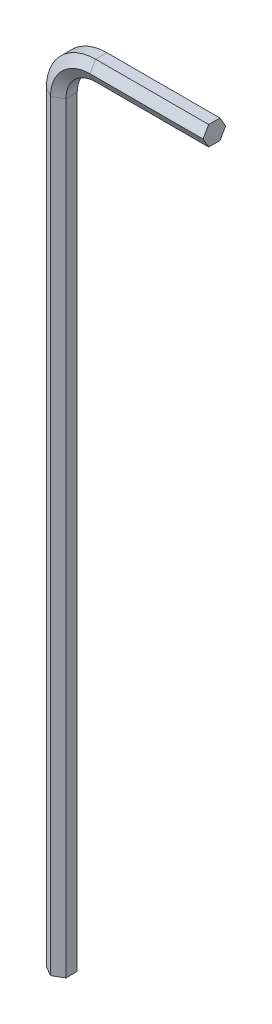
ISO-10303-21;
HEADER;
FILE_DESCRIPTION(('STEP AP214'),'2;1');
FILE_NAME('part.step','',(''),(''),'','','');
FILE_SCHEMA(('AUTOMOTIVE_DESIGN { 1 0 10303 214 1 1 1 1 }'));
ENDSEC;
DATA;
#1=APPLICATION_CONTEXT('core data for automotive mechanical design processes');
#2=APPLICATION_PROTOCOL_DEFINITION('international standard','automotive_design',2000,#1);
#3=PRODUCT_CONTEXT('',#1,'mechanical');
#4=PRODUCT('Part','Part','',(#3));
#5=PRODUCT_RELATED_PRODUCT_CATEGORY('part','',(#4));
#6=PRODUCT_DEFINITION_FORMATION('','',#4);
#7=PRODUCT_DEFINITION_CONTEXT('part definition',#1,'design');
#8=PRODUCT_DEFINITION('design','',#6,#7);
#9=PRODUCT_DEFINITION_SHAPE('','',#8);
#10=(LENGTH_UNIT() NAMED_UNIT(*) SI_UNIT(.MILLI.,.METRE.));
#11=(NAMED_UNIT(*) PLANE_ANGLE_UNIT() SI_UNIT($,.RADIAN.));
#12=(NAMED_UNIT(*) SI_UNIT($,.STERADIAN.) SOLID_ANGLE_UNIT());
#13=UNCERTAINTY_MEASURE_WITH_UNIT(LENGTH_MEASURE(1.E-05),#10,'distance_accuracy_value','');
#14=(GEOMETRIC_REPRESENTATION_CONTEXT(3) GLOBAL_UNCERTAINTY_ASSIGNED_CONTEXT((#13)) GLOBAL_UNIT_ASSIGNED_CONTEXT((#10,
#11,#12)) REPRESENTATION_CONTEXT('',''));
#15=CARTESIAN_POINT('',(0.,0.,0.));
#16=DIRECTION('',(0.,0.,1.));
#17=DIRECTION('',(1.,0.,0.));
#18=AXIS2_PLACEMENT_3D('',#15,#16,#17);
#19=CARTESIAN_POINT('',(4.00000000000005,82.2,-0.571923176659244));
#20=DIRECTION('',(0.,1.,0.));
#21=DIRECTION('',(0.,0.,1.));
#22=AXIS2_PLACEMENT_3D('',#19,#20,#21);
#23=PLANE('',#22);
#24=DIRECTION('',(0.,0.,1.));
#25=VECTOR('',#24,1.);
#26=CARTESIAN_POINT('',(4.00000000000005,82.2,-0.571923176659244));
#27=LINE('',#26,#25);
#28=CARTESIAN_POINT('',(4.00000000000005,82.2,-0.571923176659244));
#29=VERTEX_POINT('',#28);
#30=CARTESIAN_POINT('',(4.00000000000005,82.2,0.571923176659243));
#31=VERTEX_POINT('',#30);
#32=EDGE_CURVE('E130',#29,#31,#27,.T.);
#33=ORIENTED_EDGE('',*,*,#32,.T.);
#34=DIRECTION('',(1.,0.,0.));
#35=VECTOR('',#34,1.);
#36=CARTESIAN_POINT('',(4.00000000000005,82.2,0.571923176659243));
#37=LINE('',#36,#35);
#38=CARTESIAN_POINT('',(15.4694,82.2,0.571923176659243));
#39=VERTEX_POINT('',#38);
#40=EDGE_CURVE('E39',#31,#39,#37,.T.);
#41=ORIENTED_EDGE('',*,*,#40,.T.);
#42=DIRECTION('',(0.,0.,1.));
#43=VECTOR('',#42,1.);
#44=CARTESIAN_POINT('',(15.4694,82.2,-0.571923176659244));
#45=LINE('',#44,#43);
#46=CARTESIAN_POINT('',(15.4694,82.2,-0.571923176659244));
#47=VERTEX_POINT('',#46);
#48=EDGE_CURVE('E46',#47,#39,#45,.T.);
#49=ORIENTED_EDGE('',*,*,#48,.F.);
#50=DIRECTION('',(1.,0.,0.));
#51=VECTOR('',#50,1.);
#52=CARTESIAN_POINT('',(4.00000000000005,82.2,-0.571923176659244));
#53=LINE('',#52,#51);
#54=EDGE_CURVE('E11',#29,#47,#53,.T.);
#55=ORIENTED_EDGE('',*,*,#54,.F.);
#56=EDGE_LOOP('',(#33,#41,#49,#55));
#57=FACE_BOUND('',#56,.T.);
#58=ADVANCED_FACE('F32',(#57),#23,.T.);
#59=CARTESIAN_POINT('',(4.00000000000005,82.2,0.571923176659243));
#60=DIRECTION('',(0.,0.5,0.866025403784439));
#61=DIRECTION('',(0.,-0.866025403784439,0.5));
#62=AXIS2_PLACEMENT_3D('',#59,#60,#61);
#63=PLANE('',#62);
#64=DIRECTION('',(0.,-0.866025403784439,0.5));
#65=VECTOR('',#64,1.);
#66=CARTESIAN_POINT('',(4.00000000000005,82.2,0.571923176659243));
#67=LINE('',#66,#65);
#68=CARTESIAN_POINT('',(4.00000000000003,81.2094,1.14384635331849));
#69=VERTEX_POINT('',#68);
#70=EDGE_CURVE('E177',#31,#69,#67,.T.);
#71=ORIENTED_EDGE('',*,*,#70,.T.);
#72=DIRECTION('',(1.,0.,0.));
#73=VECTOR('',#72,1.);
#74=CARTESIAN_POINT('',(4.00000000000003,81.2094,1.14384635331849));
#75=LINE('',#74,#73);
#76=CARTESIAN_POINT('',(15.4694,81.2094,1.14384635331849));
#77=VERTEX_POINT('',#76);
#78=EDGE_CURVE('E213',#69,#77,#75,.T.);
#79=ORIENTED_EDGE('',*,*,#78,.T.);
#80=DIRECTION('',(0.,-0.866025403784439,0.5));
#81=VECTOR('',#80,1.);
#82=CARTESIAN_POINT('',(15.4694,82.2,0.571923176659243));
#83=LINE('',#82,#81);
#84=EDGE_CURVE('E54',#39,#77,#83,.T.);
#85=ORIENTED_EDGE('',*,*,#84,.F.);
#86=ORIENTED_EDGE('',*,*,#40,.F.);
#87=EDGE_LOOP('',(#71,#79,#85,#86));
#88=FACE_BOUND('',#87,.T.);
#89=ADVANCED_FACE('F215',(#88),#63,.T.);
#90=CARTESIAN_POINT('',(4.00000000000003,81.2094,1.14384635331849));
#91=DIRECTION('',(0.,-0.5,0.866025403784439));
#92=DIRECTION('',(0.,-0.866025403784439,-0.5));
#93=AXIS2_PLACEMENT_3D('',#90,#91,#92);
#94=PLANE('',#93);
#95=DIRECTION('',(0.,-0.866025403784439,-0.5));
#96=VECTOR('',#95,1.);
#97=CARTESIAN_POINT('',(4.00000000000003,81.2094,1.14384635331849));
#98=LINE('',#97,#96);
#99=CARTESIAN_POINT('',(4.00000000000002,80.2188,0.571923176659244));
#100=VERTEX_POINT('',#99);
#101=EDGE_CURVE('E174',#69,#100,#98,.T.);
#102=ORIENTED_EDGE('',*,*,#101,.T.);
#103=DIRECTION('',(1.,0.,0.));
#104=VECTOR('',#103,1.);
#105=CARTESIAN_POINT('',(4.00000000000002,80.2188,0.571923176659244));
#106=LINE('',#105,#104);
#107=CARTESIAN_POINT('',(15.4694,80.2188,0.571923176659244));
#108=VERTEX_POINT('',#107);
#109=EDGE_CURVE('E210',#100,#108,#106,.T.);
#110=ORIENTED_EDGE('',*,*,#109,.T.);
#111=DIRECTION('',(0.,-0.866025403784439,-0.5));
#112=VECTOR('',#111,1.);
#113=CARTESIAN_POINT('',(15.4694,81.2094,1.14384635331849));
#114=LINE('',#113,#112);
#115=EDGE_CURVE('E199',#77,#108,#114,.T.);
#116=ORIENTED_EDGE('',*,*,#115,.F.);
#117=ORIENTED_EDGE('',*,*,#78,.F.);
#118=EDGE_LOOP('',(#102,#110,#116,#117));
#119=FACE_BOUND('',#118,.T.);
#120=ADVANCED_FACE('F280',(#119),#94,.T.);
#121=CARTESIAN_POINT('',(4.00000000000002,80.2188,0.571923176659244));
#122=DIRECTION('',(0.,-1.,0.));
#123=DIRECTION('',(0.,0.,-1.));
#124=AXIS2_PLACEMENT_3D('',#121,#122,#123);
#125=PLANE('',#124);
#126=DIRECTION('',(0.,0.,-1.));
#127=VECTOR('',#126,1.);
#128=CARTESIAN_POINT('',(4.00000000000002,80.2188,0.571923176659244));
#129=LINE('',#128,#127);
#130=CARTESIAN_POINT('',(4.00000000000002,80.2188,-0.571923176659243));
#131=VERTEX_POINT('',#130);
#132=EDGE_CURVE('E171',#100,#131,#129,.T.);
#133=ORIENTED_EDGE('',*,*,#132,.T.);
#134=DIRECTION('',(1.,0.,0.));
#135=VECTOR('',#134,1.);
#136=CARTESIAN_POINT('',(4.00000000000002,80.2188,-0.571923176659243));
#137=LINE('',#136,#135);
#138=CARTESIAN_POINT('',(15.4694,80.2188,-0.571923176659243));
#139=VERTEX_POINT('',#138);
#140=EDGE_CURVE('E207',#131,#139,#137,.T.);
#141=ORIENTED_EDGE('',*,*,#140,.T.);
#142=DIRECTION('',(0.,0.,-1.));
#143=VECTOR('',#142,1.);
#144=CARTESIAN_POINT('',(15.4694,80.2188,0.571923176659244));
#145=LINE('',#144,#143);
#146=EDGE_CURVE('E196',#108,#139,#145,.T.);
#147=ORIENTED_EDGE('',*,*,#146,.F.);
#148=ORIENTED_EDGE('',*,*,#109,.F.);
#149=EDGE_LOOP('',(#133,#141,#147,#148));
#150=FACE_BOUND('',#149,.T.);
#151=ADVANCED_FACE('F279',(#150),#125,.T.);
#152=CARTESIAN_POINT('',(4.00000000000002,80.2188,-0.571923176659243));
#153=DIRECTION('',(0.,-0.5,-0.866025403784438));
#154=DIRECTION('',(0.,0.866025403784439,-0.5));
#155=AXIS2_PLACEMENT_3D('',#152,#153,#154);
#156=PLANE('',#155);
#157=DIRECTION('',(0.,0.866025403784439,-0.5));
#158=VECTOR('',#157,1.);
#159=CARTESIAN_POINT('',(4.00000000000002,80.2188,-0.571923176659243));
#160=LINE('',#159,#158);
#161=CARTESIAN_POINT('',(4.00000000000003,81.2094,-1.14384635331849));
#162=VERTEX_POINT('',#161);
#163=EDGE_CURVE('E163',#131,#162,#160,.T.);
#164=ORIENTED_EDGE('',*,*,#163,.T.);
#165=DIRECTION('',(1.,0.,0.));
#166=VECTOR('',#165,1.);
#167=CARTESIAN_POINT('',(4.00000000000003,81.2094,-1.14384635331849));
#168=LINE('',#167,#166);
#169=CARTESIAN_POINT('',(15.4694,81.2094,-1.14384635331849));
#170=VERTEX_POINT('',#169);
#171=EDGE_CURVE('E204',#162,#170,#168,.T.);
#172=ORIENTED_EDGE('',*,*,#171,.T.);
#173=DIRECTION('',(0.,0.866025403784439,-0.5));
#174=VECTOR('',#173,1.);
#175=CARTESIAN_POINT('',(15.4694,80.2188,-0.571923176659243));
#176=LINE('',#175,#174);
#177=EDGE_CURVE('E193',#139,#170,#176,.T.);
#178=ORIENTED_EDGE('',*,*,#177,.F.);
#179=ORIENTED_EDGE('',*,*,#140,.F.);
#180=EDGE_LOOP('',(#164,#172,#178,#179));
#181=FACE_BOUND('',#180,.T.);
#182=ADVANCED_FACE('F286',(#181),#156,.T.);
#183=CARTESIAN_POINT('',(4.00000000000003,81.2094,-1.14384635331849));
#184=DIRECTION('',(0.,0.5,-0.866025403784439));
#185=DIRECTION('',(0.,0.866025403784439,0.5));
#186=AXIS2_PLACEMENT_3D('',#183,#184,#185);
#187=PLANE('',#186);
#188=DIRECTION('',(0.,0.866025403784439,0.5));
#189=VECTOR('',#188,1.);
#190=CARTESIAN_POINT('',(4.00000000000003,81.2094,-1.14384635331849));
#191=LINE('',#190,#189);
#192=EDGE_CURVE('E160',#162,#29,#191,.T.);
#193=ORIENTED_EDGE('',*,*,#192,.T.);
#194=ORIENTED_EDGE('',*,*,#54,.T.);
#195=DIRECTION('',(0.,0.866025403784439,0.5));
#196=VECTOR('',#195,1.);
#197=CARTESIAN_POINT('',(15.4694,81.2094,-1.14384635331849));
#198=LINE('',#197,#196);
#199=EDGE_CURVE('E133',#170,#47,#198,.T.);
#200=ORIENTED_EDGE('',*,*,#199,.F.);
#201=ORIENTED_EDGE('',*,*,#171,.F.);
#202=EDGE_LOOP('',(#193,#194,#200,#201));
#203=FACE_BOUND('',#202,.T.);
#204=ADVANCED_FACE('F284',(#203),#187,.T.);
#205=CARTESIAN_POINT('',(4.,77.2094,0.));
#206=DIRECTION('',(0.,0.,-1.));
#207=DIRECTION('',(-1.,0.,0.));
#208=AXIS2_PLACEMENT_3D('',#205,#206,#207);
#209=CYLINDRICAL_SURFACE('',#208,4.9906);
#210=DIRECTION('',(0.,0.,1.));
#211=VECTOR('',#210,1.);
#212=CARTESIAN_POINT('',(-0.9906,77.2094,-0.571923176659244));
#213=LINE('',#212,#211);
#214=CARTESIAN_POINT('',(-0.9906,77.2094,-0.571923176659244));
#215=VERTEX_POINT('',#214);
#216=CARTESIAN_POINT('',(-0.9906,77.2094,0.571923176659243));
#217=VERTEX_POINT('',#216);
#218=EDGE_CURVE('E127',#215,#217,#213,.T.);
#219=ORIENTED_EDGE('',*,*,#218,.T.);
#220=CARTESIAN_POINT('',(4.,77.2094,0.571923176659243));
#221=DIRECTION('',(0.,0.,-1.));
#222=DIRECTION('',(-1.,0.,0.));
#223=AXIS2_PLACEMENT_3D('',#220,#221,#222);
#224=CIRCLE('',#223,4.9906);
#225=EDGE_CURVE('E134',#217,#31,#224,.T.);
#226=ORIENTED_EDGE('',*,*,#225,.T.);
#227=ORIENTED_EDGE('',*,*,#32,.F.);
#228=CARTESIAN_POINT('',(4.,77.2094,-0.571923176659244));
#229=DIRECTION('',(0.,0.,-1.));
#230=DIRECTION('',(-1.,0.,0.));
#231=AXIS2_PLACEMENT_3D('',#228,#229,#230);
#232=CIRCLE('',#231,4.9906);
#233=EDGE_CURVE('E122',#215,#29,#232,.T.);
#234=ORIENTED_EDGE('',*,*,#233,.F.);
#235=EDGE_LOOP('',(#219,#226,#227,#234));
#236=FACE_BOUND('',#235,.T.);
#237=ADVANCED_FACE('F124',(#236),#209,.T.);
#238=CARTESIAN_POINT('',(4.,77.2094,0.571923176659243));
#239=DIRECTION('',(0.,0.,-1.));
#240=DIRECTION('',(-1.,0.,0.));
#241=AXIS2_PLACEMENT_3D('',#238,#239,#240);
#242=CONICAL_SURFACE('',#241,4.9906,1.0471975511966);
#243=DIRECTION('',(0.866025403784439,0.,0.5));
#244=VECTOR('',#243,1.);
#245=CARTESIAN_POINT('',(-0.9906,77.2094,0.571923176659243));
#246=LINE('',#245,#244);
#247=CARTESIAN_POINT('',(0.,77.2094,1.14384635331849));
#248=VERTEX_POINT('',#247);
#249=EDGE_CURVE('E155',#217,#248,#246,.T.);
#250=ORIENTED_EDGE('',*,*,#249,.T.);
#251=CARTESIAN_POINT('',(4.,77.2094,1.14384635331849));
#252=DIRECTION('',(0.,0.,-1.));
#253=DIRECTION('',(-1.,0.,0.));
#254=AXIS2_PLACEMENT_3D('',#251,#252,#253);
#255=CIRCLE('',#254,4.);
#256=EDGE_CURVE('E188',#248,#69,#255,.T.);
#257=ORIENTED_EDGE('',*,*,#256,.T.);
#258=ORIENTED_EDGE('',*,*,#70,.F.);
#259=ORIENTED_EDGE('',*,*,#225,.F.);
#260=EDGE_LOOP('',(#250,#257,#258,#259));
#261=FACE_BOUND('',#260,.T.);
#262=ADVANCED_FACE('F224',(#261),#242,.T.);
#263=CARTESIAN_POINT('',(4.,77.2094,1.14384635331849));
#264=DIRECTION('',(0.,0.,1.));
#265=DIRECTION('',(1.,0.,0.));
#266=AXIS2_PLACEMENT_3D('',#263,#264,#265);
#267=CONICAL_SURFACE('',#266,4.,1.0471975511966);
#268=DIRECTION('',(0.866025403784439,0.,-0.5));
#269=VECTOR('',#268,1.);
#270=CARTESIAN_POINT('',(0.,77.2094,1.14384635331849));
#271=LINE('',#270,#269);
#272=CARTESIAN_POINT('',(0.990600000000001,77.2094,0.571923176659244));
#273=VERTEX_POINT('',#272);
#274=EDGE_CURVE('E227',#248,#273,#271,.T.);
#275=ORIENTED_EDGE('',*,*,#274,.T.);
#276=CARTESIAN_POINT('',(4.,77.2094,0.571923176659244));
#277=DIRECTION('',(0.,0.,-1.));
#278=DIRECTION('',(-1.,0.,0.));
#279=AXIS2_PLACEMENT_3D('',#276,#277,#278);
#280=CIRCLE('',#279,3.0094);
#281=EDGE_CURVE('E185',#273,#100,#280,.T.);
#282=ORIENTED_EDGE('',*,*,#281,.T.);
#283=ORIENTED_EDGE('',*,*,#101,.F.);
#284=ORIENTED_EDGE('',*,*,#256,.F.);
#285=EDGE_LOOP('',(#275,#282,#283,#284));
#286=FACE_BOUND('',#285,.T.);
#287=ADVANCED_FACE('F220',(#286),#267,.F.);
#288=CARTESIAN_POINT('',(4.,77.2094,0.));
#289=DIRECTION('',(0.,0.,-1.));
#290=DIRECTION('',(-1.,0.,0.));
#291=AXIS2_PLACEMENT_3D('',#288,#289,#290);
#292=CYLINDRICAL_SURFACE('',#291,3.0094);
#293=DIRECTION('',(0.,0.,-1.));
#294=VECTOR('',#293,1.);
#295=CARTESIAN_POINT('',(0.990600000000001,77.2094,0.571923176659244));
#296=LINE('',#295,#294);
#297=CARTESIAN_POINT('',(0.990600000000001,77.2094,-0.571923176659243));
#298=VERTEX_POINT('',#297);
#299=EDGE_CURVE('E241',#273,#298,#296,.T.);
#300=ORIENTED_EDGE('',*,*,#299,.T.);
#301=CARTESIAN_POINT('',(4.,77.2094,-0.571923176659243));
#302=DIRECTION('',(0.,0.,-1.));
#303=DIRECTION('',(-1.,0.,0.));
#304=AXIS2_PLACEMENT_3D('',#301,#302,#303);
#305=CIRCLE('',#304,3.0094);
#306=EDGE_CURVE('E182',#298,#131,#305,.T.);
#307=ORIENTED_EDGE('',*,*,#306,.T.);
#308=ORIENTED_EDGE('',*,*,#132,.F.);
#309=ORIENTED_EDGE('',*,*,#281,.F.);
#310=EDGE_LOOP('',(#300,#307,#308,#309));
#311=FACE_BOUND('',#310,.T.);
#312=ADVANCED_FACE('F277',(#311),#292,.F.);
#313=CARTESIAN_POINT('',(4.,77.2094,-0.571923176659243));
#314=DIRECTION('',(0.,0.,-1.));
#315=DIRECTION('',(-1.,0.,0.));
#316=AXIS2_PLACEMENT_3D('',#313,#314,#315);
#317=CONICAL_SURFACE('',#316,3.0094,1.0471975511966);
#318=DIRECTION('',(-0.866025403784439,0.,-0.5));
#319=VECTOR('',#318,1.);
#320=CARTESIAN_POINT('',(0.990600000000001,77.2094,-0.571923176659243));
#321=LINE('',#320,#319);
#322=CARTESIAN_POINT('',(0.,77.2094,-1.14384635331849));
#323=VERTEX_POINT('',#322);
#324=EDGE_CURVE('E244',#298,#323,#321,.T.);
#325=ORIENTED_EDGE('',*,*,#324,.T.);
#326=CARTESIAN_POINT('',(4.,77.2094,-1.14384635331849));
#327=DIRECTION('',(0.,0.,-1.));
#328=DIRECTION('',(-1.,0.,0.));
#329=AXIS2_PLACEMENT_3D('',#326,#327,#328);
#330=CIRCLE('',#329,4.);
#331=EDGE_CURVE('E140',#323,#162,#330,.T.);
#332=ORIENTED_EDGE('',*,*,#331,.T.);
#333=ORIENTED_EDGE('',*,*,#163,.F.);
#334=ORIENTED_EDGE('',*,*,#306,.F.);
#335=EDGE_LOOP('',(#325,#332,#333,#334));
#336=FACE_BOUND('',#335,.T.);
#337=ADVANCED_FACE('F274',(#336),#317,.F.);
#338=CARTESIAN_POINT('',(4.,77.2094,-1.14384635331849));
#339=DIRECTION('',(0.,0.,1.));
#340=DIRECTION('',(1.,0.,0.));
#341=AXIS2_PLACEMENT_3D('',#338,#339,#340);
#342=CONICAL_SURFACE('',#341,4.,1.0471975511966);
#343=DIRECTION('',(-0.866025403784439,0.,0.5));
#344=VECTOR('',#343,1.);
#345=CARTESIAN_POINT('',(0.,77.2094,-1.14384635331849));
#346=LINE('',#345,#344);
#347=EDGE_CURVE('E137',#323,#215,#346,.T.);
#348=ORIENTED_EDGE('',*,*,#347,.T.);
#349=ORIENTED_EDGE('',*,*,#233,.T.);
#350=ORIENTED_EDGE('',*,*,#192,.F.);
#351=ORIENTED_EDGE('',*,*,#331,.F.);
#352=EDGE_LOOP('',(#348,#349,#350,#351));
#353=FACE_BOUND('',#352,.T.);
#354=ADVANCED_FACE('F138',(#353),#342,.T.);
#355=CARTESIAN_POINT('',(0.,77.2094,-1.14384635331849));
#356=DIRECTION('',(0.5,0.,0.866025403784439));
#357=DIRECTION('',(0.866025403784439,0.,-0.5));
#358=AXIS2_PLACEMENT_3D('',#355,#356,#357);
#359=PLANE('',#358);
#360=DIRECTION('',(-0.866025403784439,0.,0.5));
#361=VECTOR('',#360,1.);
#362=CARTESIAN_POINT('',(0.,0.,-1.14384635331849));
#363=LINE('',#362,#361);
#364=CARTESIAN_POINT('',(0.,0.,-1.14384635331849));
#365=VERTEX_POINT('',#364);
#366=CARTESIAN_POINT('',(-0.9906,0.,-0.571923176659244));
#367=VERTEX_POINT('',#366);
#368=EDGE_CURVE('E159',#365,#367,#363,.T.);
#369=ORIENTED_EDGE('',*,*,#368,.T.);
#370=DIRECTION('',(0.,-1.,0.));
#371=VECTOR('',#370,1.);
#372=CARTESIAN_POINT('',(-0.9906,77.2094,-0.571923176659244));
#373=LINE('',#372,#371);
#374=EDGE_CURVE('E150',#215,#367,#373,.T.);
#375=ORIENTED_EDGE('',*,*,#374,.F.);
#376=ORIENTED_EDGE('',*,*,#347,.F.);
#377=DIRECTION('',(0.,-1.,0.));
#378=VECTOR('',#377,1.);
#379=CARTESIAN_POINT('',(0.,77.2094,-1.14384635331849));
#380=LINE('',#379,#378);
#381=EDGE_CURVE('E248',#323,#365,#380,.T.);
#382=ORIENTED_EDGE('',*,*,#381,.T.);
#383=EDGE_LOOP('',(#369,#375,#376,#382));
#384=FACE_BOUND('',#383,.T.);
#385=ADVANCED_FACE('F157',(#384),#359,.F.);
#386=CARTESIAN_POINT('',(-0.9906,77.2094,-0.571923176659244));
#387=DIRECTION('',(1.,0.,0.));
#388=DIRECTION('',(0.,0.,-1.));
#389=AXIS2_PLACEMENT_3D('',#386,#387,#388);
#390=PLANE('',#389);
#391=DIRECTION('',(0.,0.,1.));
#392=VECTOR('',#391,1.);
#393=CARTESIAN_POINT('',(-0.9906,0.,-0.571923176659244));
#394=LINE('',#393,#392);
#395=CARTESIAN_POINT('',(-0.9906,0.,0.571923176659243));
#396=VERTEX_POINT('',#395);
#397=EDGE_CURVE('E250',#367,#396,#394,.T.);
#398=ORIENTED_EDGE('',*,*,#397,.T.);
#399=DIRECTION('',(0.,-1.,0.));
#400=VECTOR('',#399,1.);
#401=CARTESIAN_POINT('',(-0.9906,77.2094,0.571923176659243));
#402=LINE('',#401,#400);
#403=EDGE_CURVE('E153',#217,#396,#402,.T.);
#404=ORIENTED_EDGE('',*,*,#403,.F.);
#405=ORIENTED_EDGE('',*,*,#218,.F.);
#406=ORIENTED_EDGE('',*,*,#374,.T.);
#407=EDGE_LOOP('',(#398,#404,#405,#406));
#408=FACE_BOUND('',#407,.T.);
#409=ADVANCED_FACE('F149',(#408),#390,.F.);
#410=CARTESIAN_POINT('',(-0.9906,77.2094,0.571923176659243));
#411=DIRECTION('',(0.5,0.,-0.866025403784439));
#412=DIRECTION('',(-0.866025403784439,0.,-0.5));
#413=AXIS2_PLACEMENT_3D('',#410,#411,#412);
#414=PLANE('',#413);
#415=DIRECTION('',(0.866025403784439,0.,0.5));
#416=VECTOR('',#415,1.);
#417=CARTESIAN_POINT('',(-0.9906,0.,0.571923176659243));
#418=LINE('',#417,#416);
#419=CARTESIAN_POINT('',(0.,0.,1.14384635331849));
#420=VERTEX_POINT('',#419);
#421=EDGE_CURVE('E233',#396,#420,#418,.T.);
#422=ORIENTED_EDGE('',*,*,#421,.T.);
#423=DIRECTION('',(0.,-1.,0.));
#424=VECTOR('',#423,1.);
#425=CARTESIAN_POINT('',(0.,77.2094,1.14384635331849));
#426=LINE('',#425,#424);
#427=EDGE_CURVE('E165',#248,#420,#426,.T.);
#428=ORIENTED_EDGE('',*,*,#427,.F.);
#429=ORIENTED_EDGE('',*,*,#249,.F.);
#430=ORIENTED_EDGE('',*,*,#403,.T.);
#431=EDGE_LOOP('',(#422,#428,#429,#430));
#432=FACE_BOUND('',#431,.T.);
#433=ADVANCED_FACE('F231',(#432),#414,.F.);
#434=CARTESIAN_POINT('',(0.,77.2094,1.14384635331849));
#435=DIRECTION('',(-0.5,0.,-0.866025403784439));
#436=DIRECTION('',(-0.866025403784439,0.,0.5));
#437=AXIS2_PLACEMENT_3D('',#434,#435,#436);
#438=PLANE('',#437);
#439=DIRECTION('',(0.866025403784439,0.,-0.5));
#440=VECTOR('',#439,1.);
#441=CARTESIAN_POINT('',(0.,0.,1.14384635331849));
#442=LINE('',#441,#440);
#443=CARTESIAN_POINT('',(0.990600000000001,0.,0.571923176659244));
#444=VERTEX_POINT('',#443);
#445=EDGE_CURVE('E253',#420,#444,#442,.T.);
#446=ORIENTED_EDGE('',*,*,#445,.T.);
#447=DIRECTION('',(0.,-1.,0.));
#448=VECTOR('',#447,1.);
#449=CARTESIAN_POINT('',(0.990600000000001,77.2094,0.571923176659244));
#450=LINE('',#449,#448);
#451=EDGE_CURVE('E236',#273,#444,#450,.T.);
#452=ORIENTED_EDGE('',*,*,#451,.F.);
#453=ORIENTED_EDGE('',*,*,#274,.F.);
#454=ORIENTED_EDGE('',*,*,#427,.T.);
#455=EDGE_LOOP('',(#446,#452,#453,#454));
#456=FACE_BOUND('',#455,.T.);
#457=ADVANCED_FACE('F238',(#456),#438,.F.);
#458=CARTESIAN_POINT('',(0.990600000000001,77.2094,0.571923176659244));
#459=DIRECTION('',(-1.,0.,0.));
#460=DIRECTION('',(0.,0.,1.));
#461=AXIS2_PLACEMENT_3D('',#458,#459,#460);
#462=PLANE('',#461);
#463=DIRECTION('',(0.,0.,-1.));
#464=VECTOR('',#463,1.);
#465=CARTESIAN_POINT('',(0.990600000000001,0.,0.571923176659244));
#466=LINE('',#465,#464);
#467=CARTESIAN_POINT('',(0.990600000000001,0.,-0.571923176659243));
#468=VERTEX_POINT('',#467);
#469=EDGE_CURVE('E255',#444,#468,#466,.T.);
#470=ORIENTED_EDGE('',*,*,#469,.T.);
#471=DIRECTION('',(0.,-1.,0.));
#472=VECTOR('',#471,1.);
#473=CARTESIAN_POINT('',(0.990600000000001,77.2094,-0.571923176659243));
#474=LINE('',#473,#472);
#475=EDGE_CURVE('E259',#298,#468,#474,.T.);
#476=ORIENTED_EDGE('',*,*,#475,.F.);
#477=ORIENTED_EDGE('',*,*,#299,.F.);
#478=ORIENTED_EDGE('',*,*,#451,.T.);
#479=EDGE_LOOP('',(#470,#476,#477,#478));
#480=FACE_BOUND('',#479,.T.);
#481=ADVANCED_FACE('F264',(#480),#462,.F.);
#482=CARTESIAN_POINT('',(0.990600000000001,77.2094,-0.571923176659243));
#483=DIRECTION('',(-0.5,0.,0.866025403784439));
#484=DIRECTION('',(0.866025403784439,0.,0.5));
#485=AXIS2_PLACEMENT_3D('',#482,#483,#484);
#486=PLANE('',#485);
#487=DIRECTION('',(-0.866025403784439,0.,-0.5));
#488=VECTOR('',#487,1.);
#489=CARTESIAN_POINT('',(0.990600000000001,0.,-0.571923176659243));
#490=LINE('',#489,#488);
#491=EDGE_CURVE('E145',#468,#365,#490,.T.);
#492=ORIENTED_EDGE('',*,*,#491,.T.);
#493=ORIENTED_EDGE('',*,*,#381,.F.);
#494=ORIENTED_EDGE('',*,*,#324,.F.);
#495=ORIENTED_EDGE('',*,*,#475,.T.);
#496=EDGE_LOOP('',(#492,#493,#494,#495));
#497=FACE_BOUND('',#496,.T.);
#498=ADVANCED_FACE('F271',(#497),#486,.F.);
#499=CARTESIAN_POINT('',(15.4694,81.2094,0.));
#500=DIRECTION('',(1.,0.,0.));
#501=DIRECTION('',(0.,0.,1.));
#502=AXIS2_PLACEMENT_3D('',#499,#500,#501);
#503=PLANE('',#502);
#504=ORIENTED_EDGE('',*,*,#199,.T.);
#505=ORIENTED_EDGE('',*,*,#48,.T.);
#506=ORIENTED_EDGE('',*,*,#84,.T.);
#507=ORIENTED_EDGE('',*,*,#115,.T.);
#508=ORIENTED_EDGE('',*,*,#146,.T.);
#509=ORIENTED_EDGE('',*,*,#177,.T.);
#510=EDGE_LOOP('',(#504,#505,#506,#507,#508,#509));
#511=FACE_BOUND('',#510,.T.);
#512=ADVANCED_FACE('F282',(#511),#503,.T.);
#513=CARTESIAN_POINT('',(0.,0.,0.));
#514=DIRECTION('',(0.,1.,0.));
#515=DIRECTION('',(0.,0.,1.));
#516=AXIS2_PLACEMENT_3D('',#513,#514,#515);
#517=PLANE('',#516);
#518=ORIENTED_EDGE('',*,*,#368,.F.);
#519=ORIENTED_EDGE('',*,*,#491,.F.);
#520=ORIENTED_EDGE('',*,*,#469,.F.);
#521=ORIENTED_EDGE('',*,*,#445,.F.);
#522=ORIENTED_EDGE('',*,*,#421,.F.);
#523=ORIENTED_EDGE('',*,*,#397,.F.);
#524=EDGE_LOOP('',(#518,#519,#520,#521,#522,#523));
#525=FACE_BOUND('',#524,.T.);
#526=ADVANCED_FACE('F268',(#525),#517,.F.);
#527=CLOSED_SHELL('',(#58,#89,#120,#151,#182,#204,#237,#262,#287,#312,#337,#354,#385,#409,#433,
#457,#481,#498,#512,#526));
#528=MANIFOLD_SOLID_BREP('B2',#527);
#529=ADVANCED_BREP_SHAPE_REPRESENTATION('',(#18,#528),#14);
#530=SHAPE_DEFINITION_REPRESENTATION(#9,#529);
ENDSEC;
END-ISO-10303-21;
